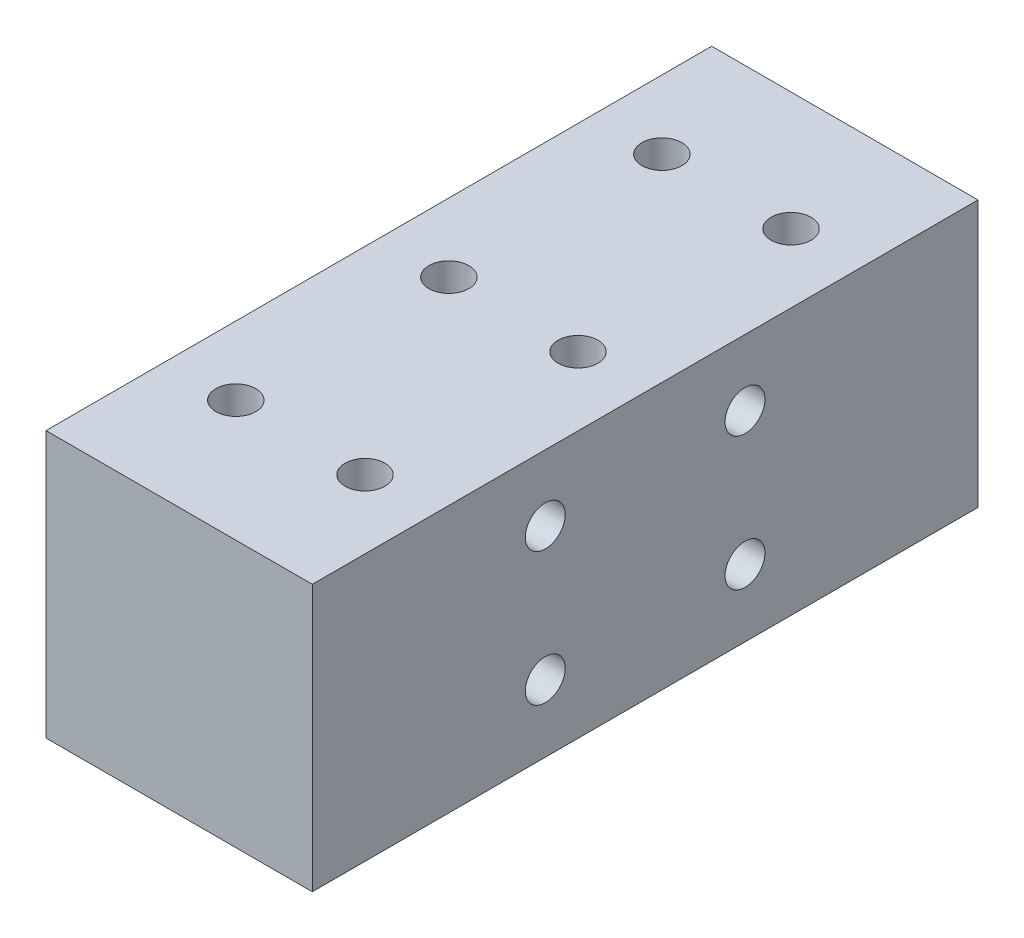
ISO-10303-21;
HEADER;
FILE_DESCRIPTION(('STEP AP214'),'2;1');
FILE_NAME('part.step','',(''),(''),'','','');
FILE_SCHEMA(('AUTOMOTIVE_DESIGN { 1 0 10303 214 1 1 1 1 }'));
ENDSEC;
DATA;
#1=APPLICATION_CONTEXT('core data for automotive mechanical design processes');
#2=APPLICATION_PROTOCOL_DEFINITION('international standard','automotive_design',2000,#1);
#3=PRODUCT_CONTEXT('',#1,'mechanical');
#4=PRODUCT('Part','Part','',(#3));
#5=PRODUCT_RELATED_PRODUCT_CATEGORY('part','',(#4));
#6=PRODUCT_DEFINITION_FORMATION('','',#4);
#7=PRODUCT_DEFINITION_CONTEXT('part definition',#1,'design');
#8=PRODUCT_DEFINITION('design','',#6,#7);
#9=PRODUCT_DEFINITION_SHAPE('','',#8);
#10=(LENGTH_UNIT() NAMED_UNIT(*) SI_UNIT(.MILLI.,.METRE.));
#11=(NAMED_UNIT(*) PLANE_ANGLE_UNIT() SI_UNIT($,.RADIAN.));
#12=(NAMED_UNIT(*) SI_UNIT($,.STERADIAN.) SOLID_ANGLE_UNIT());
#13=UNCERTAINTY_MEASURE_WITH_UNIT(LENGTH_MEASURE(1.E-05),#10,'distance_accuracy_value','');
#14=(GEOMETRIC_REPRESENTATION_CONTEXT(3) GLOBAL_UNCERTAINTY_ASSIGNED_CONTEXT((#13)) GLOBAL_UNIT_ASSIGNED_CONTEXT((#10,
#11,#12)) REPRESENTATION_CONTEXT('',''));
#15=CARTESIAN_POINT('',(0.,0.,0.));
#16=DIRECTION('',(0.,0.,1.));
#17=DIRECTION('',(1.,0.,0.));
#18=AXIS2_PLACEMENT_3D('',#15,#16,#17);
#19=CARTESIAN_POINT('',(10.,-10.,50.));
#20=DIRECTION('',(-1.,0.,0.));
#21=DIRECTION('',(0.,0.,1.));
#22=AXIS2_PLACEMENT_3D('',#19,#20,#21);
#23=PLANE('',#22);
#24=CARTESIAN_POINT('',(10.,5.05,17.5));
#25=DIRECTION('',(1.,0.,0.));
#26=DIRECTION('',(0.,0.,-1.));
#27=AXIS2_PLACEMENT_3D('',#24,#25,#26);
#28=CIRCLE('',#27,1.5);
#29=CARTESIAN_POINT('',(10.,5.05,16.));
#30=VERTEX_POINT('',#29);
#31=EDGE_CURVE('E123',#30,#30,#28,.T.);
#32=ORIENTED_EDGE('',*,*,#31,.F.);
#33=EDGE_LOOP('',(#32));
#34=FACE_BOUND('',#33,.T.);
#35=CARTESIAN_POINT('',(10.,-4.95,32.5));
#36=DIRECTION('',(1.,0.,0.));
#37=DIRECTION('',(0.,0.,-1.));
#38=AXIS2_PLACEMENT_3D('',#35,#36,#37);
#39=CIRCLE('',#38,1.5);
#40=CARTESIAN_POINT('',(10.,-4.95,31.));
#41=VERTEX_POINT('',#40);
#42=EDGE_CURVE('E124',#41,#41,#39,.T.);
#43=ORIENTED_EDGE('',*,*,#42,.F.);
#44=EDGE_LOOP('',(#43));
#45=FACE_BOUND('',#44,.T.);
#46=CARTESIAN_POINT('',(10.,-4.95,17.5));
#47=DIRECTION('',(1.,0.,0.));
#48=DIRECTION('',(0.,0.,-1.));
#49=AXIS2_PLACEMENT_3D('',#46,#47,#48);
#50=CIRCLE('',#49,1.5);
#51=CARTESIAN_POINT('',(10.,-4.95,16.));
#52=VERTEX_POINT('',#51);
#53=EDGE_CURVE('E131',#52,#52,#50,.T.);
#54=ORIENTED_EDGE('',*,*,#53,.F.);
#55=EDGE_LOOP('',(#54));
#56=FACE_BOUND('',#55,.T.);
#57=CARTESIAN_POINT('',(10.,5.05,32.5));
#58=DIRECTION('',(1.,0.,0.));
#59=DIRECTION('',(0.,0.,-1.));
#60=AXIS2_PLACEMENT_3D('',#57,#58,#59);
#61=CIRCLE('',#60,1.5);
#62=CARTESIAN_POINT('',(10.,5.05,31.));
#63=VERTEX_POINT('',#62);
#64=EDGE_CURVE('E120',#63,#63,#61,.T.);
#65=ORIENTED_EDGE('',*,*,#64,.F.);
#66=EDGE_LOOP('',(#65));
#67=FACE_BOUND('',#66,.T.);
#68=DIRECTION('',(0.,1.,0.));
#69=VECTOR('',#68,1.);
#70=CARTESIAN_POINT('',(10.,-10.,0.));
#71=LINE('',#70,#69);
#72=CARTESIAN_POINT('',(10.,-10.,0.));
#73=VERTEX_POINT('',#72);
#74=CARTESIAN_POINT('',(10.,10.,0.));
#75=VERTEX_POINT('',#74);
#76=EDGE_CURVE('E104',#73,#75,#71,.T.);
#77=ORIENTED_EDGE('',*,*,#76,.T.);
#78=DIRECTION('',(0.,0.,-1.));
#79=VECTOR('',#78,1.);
#80=CARTESIAN_POINT('',(10.,10.,50.));
#81=LINE('',#80,#79);
#82=CARTESIAN_POINT('',(10.,10.,50.));
#83=VERTEX_POINT('',#82);
#84=EDGE_CURVE('E11',#83,#75,#81,.T.);
#85=ORIENTED_EDGE('',*,*,#84,.F.);
#86=DIRECTION('',(0.,1.,0.));
#87=VECTOR('',#86,1.);
#88=CARTESIAN_POINT('',(10.,-10.,50.));
#89=LINE('',#88,#87);
#90=CARTESIAN_POINT('',(10.,-10.,50.));
#91=VERTEX_POINT('',#90);
#92=EDGE_CURVE('E92',#91,#83,#89,.T.);
#93=ORIENTED_EDGE('',*,*,#92,.F.);
#94=DIRECTION('',(0.,0.,-1.));
#95=VECTOR('',#94,1.);
#96=CARTESIAN_POINT('',(10.,-10.,50.));
#97=LINE('',#96,#95);
#98=EDGE_CURVE('E100',#91,#73,#97,.T.);
#99=ORIENTED_EDGE('',*,*,#98,.T.);
#100=EDGE_LOOP('',(#77,#85,#93,#99));
#101=FACE_BOUND('',#100,.T.);
#102=ADVANCED_FACE('F41',(#34,#45,#56,#67,#101),#23,.F.);
#103=CARTESIAN_POINT('',(-10.,10.,50.));
#104=DIRECTION('',(0.,-1.,0.));
#105=DIRECTION('',(0.,0.,-1.));
#106=AXIS2_PLACEMENT_3D('',#103,#104,#105);
#107=PLANE('',#106);
#108=CARTESIAN_POINT('',(4.85000000000739,10.,40.893026958124));
#109=DIRECTION('',(0.,-1.,0.));
#110=DIRECTION('',(0.,0.,-1.));
#111=AXIS2_PLACEMENT_3D('',#108,#109,#110);
#112=CIRCLE('',#111,1.5);
#113=CARTESIAN_POINT('',(4.85000000000739,10.,39.393026958124));
#114=VERTEX_POINT('',#113);
#115=EDGE_CURVE('E152',#114,#114,#112,.F.);
#116=ORIENTED_EDGE('',*,*,#115,.F.);
#117=EDGE_LOOP('',(#116));
#118=FACE_BOUND('',#117,.T.);
#119=CARTESIAN_POINT('',(4.8499999999996,10.,24.8930269581245));
#120=DIRECTION('',(0.,-1.,0.));
#121=DIRECTION('',(0.,0.,-1.));
#122=AXIS2_PLACEMENT_3D('',#119,#120,#121);
#123=CIRCLE('',#122,1.5);
#124=CARTESIAN_POINT('',(4.8499999999996,10.,23.3930269581245));
#125=VERTEX_POINT('',#124);
#126=EDGE_CURVE('E151',#125,#125,#123,.F.);
#127=ORIENTED_EDGE('',*,*,#126,.F.);
#128=EDGE_LOOP('',(#127));
#129=FACE_BOUND('',#128,.T.);
#130=CARTESIAN_POINT('',(4.85000000000738,10.,8.89302695812402));
#131=DIRECTION('',(0.,-1.,0.));
#132=DIRECTION('',(0.,0.,-1.));
#133=AXIS2_PLACEMENT_3D('',#130,#131,#132);
#134=CIRCLE('',#133,1.5);
#135=CARTESIAN_POINT('',(4.85000000000738,10.,7.39302695812402));
#136=VERTEX_POINT('',#135);
#137=EDGE_CURVE('E158',#136,#136,#134,.F.);
#138=ORIENTED_EDGE('',*,*,#137,.F.);
#139=EDGE_LOOP('',(#138));
#140=FACE_BOUND('',#139,.T.);
#141=CARTESIAN_POINT('',(-4.85000000000738,10.,8.89302695812402));
#142=DIRECTION('',(0.,-1.,0.));
#143=DIRECTION('',(0.,0.,-1.));
#144=AXIS2_PLACEMENT_3D('',#141,#142,#143);
#145=CIRCLE('',#144,1.5);
#146=CARTESIAN_POINT('',(-4.85000000000738,10.,7.39302695812402));
#147=VERTEX_POINT('',#146);
#148=EDGE_CURVE('E164',#147,#147,#145,.F.);
#149=ORIENTED_EDGE('',*,*,#148,.F.);
#150=EDGE_LOOP('',(#149));
#151=FACE_BOUND('',#150,.T.);
#152=CARTESIAN_POINT('',(-4.8499999999996,10.,24.8930269581245));
#153=DIRECTION('',(0.,-1.,0.));
#154=DIRECTION('',(0.,0.,-1.));
#155=AXIS2_PLACEMENT_3D('',#152,#153,#154);
#156=CIRCLE('',#155,1.5);
#157=CARTESIAN_POINT('',(-4.8499999999996,10.,23.3930269581245));
#158=VERTEX_POINT('',#157);
#159=EDGE_CURVE('E170',#158,#158,#156,.F.);
#160=ORIENTED_EDGE('',*,*,#159,.F.);
#161=EDGE_LOOP('',(#160));
#162=FACE_BOUND('',#161,.T.);
#163=CARTESIAN_POINT('',(-4.85000000000739,10.,40.893026958124));
#164=DIRECTION('',(0.,-1.,0.));
#165=DIRECTION('',(0.,0.,-1.));
#166=AXIS2_PLACEMENT_3D('',#163,#164,#165);
#167=CIRCLE('',#166,1.5);
#168=CARTESIAN_POINT('',(-4.85000000000739,10.,39.393026958124));
#169=VERTEX_POINT('',#168);
#170=EDGE_CURVE('E141',#169,#169,#167,.F.);
#171=ORIENTED_EDGE('',*,*,#170,.F.);
#172=EDGE_LOOP('',(#171));
#173=FACE_BOUND('',#172,.T.);
#174=DIRECTION('',(-1.,0.,0.));
#175=VECTOR('',#174,1.);
#176=CARTESIAN_POINT('',(-10.,10.,0.));
#177=LINE('',#176,#175);
#178=CARTESIAN_POINT('',(-10.,10.,0.));
#179=VERTEX_POINT('',#178);
#180=EDGE_CURVE('E96',#75,#179,#177,.T.);
#181=ORIENTED_EDGE('',*,*,#180,.T.);
#182=DIRECTION('',(0.,0.,-1.));
#183=VECTOR('',#182,1.);
#184=CARTESIAN_POINT('',(-10.,10.,50.));
#185=LINE('',#184,#183);
#186=CARTESIAN_POINT('',(-10.,10.,50.));
#187=VERTEX_POINT('',#186);
#188=EDGE_CURVE('E49',#187,#179,#185,.T.);
#189=ORIENTED_EDGE('',*,*,#188,.F.);
#190=DIRECTION('',(-1.,0.,0.));
#191=VECTOR('',#190,1.);
#192=CARTESIAN_POINT('',(-10.,10.,50.));
#193=LINE('',#192,#191);
#194=EDGE_CURVE('E87',#83,#187,#193,.T.);
#195=ORIENTED_EDGE('',*,*,#194,.F.);
#196=ORIENTED_EDGE('',*,*,#84,.T.);
#197=EDGE_LOOP('',(#181,#189,#195,#196));
#198=FACE_BOUND('',#197,.T.);
#199=ADVANCED_FACE('F95',(#118,#129,#140,#151,#162,#173,#198),#107,.F.);
#200=CARTESIAN_POINT('',(-10.,-10.,50.));
#201=DIRECTION('',(1.,0.,0.));
#202=DIRECTION('',(0.,0.,-1.));
#203=AXIS2_PLACEMENT_3D('',#200,#201,#202);
#204=PLANE('',#203);
#205=CARTESIAN_POINT('',(-10.,5.05,17.5));
#206=DIRECTION('',(1.,0.,0.));
#207=DIRECTION('',(0.,0.,-1.));
#208=AXIS2_PLACEMENT_3D('',#205,#206,#207);
#209=CIRCLE('',#208,1.5);
#210=CARTESIAN_POINT('',(-10.,5.05,16.));
#211=VERTEX_POINT('',#210);
#212=EDGE_CURVE('E127',#211,#211,#209,.F.);
#213=ORIENTED_EDGE('',*,*,#212,.F.);
#214=EDGE_LOOP('',(#213));
#215=FACE_BOUND('',#214,.T.);
#216=CARTESIAN_POINT('',(-10.,-4.95,32.5));
#217=DIRECTION('',(1.,0.,0.));
#218=DIRECTION('',(0.,0.,-1.));
#219=AXIS2_PLACEMENT_3D('',#216,#217,#218);
#220=CIRCLE('',#219,1.5);
#221=CARTESIAN_POINT('',(-10.,-4.95,31.));
#222=VERTEX_POINT('',#221);
#223=EDGE_CURVE('E128',#222,#222,#220,.F.);
#224=ORIENTED_EDGE('',*,*,#223,.F.);
#225=EDGE_LOOP('',(#224));
#226=FACE_BOUND('',#225,.T.);
#227=CARTESIAN_POINT('',(-10.,-4.95,17.5));
#228=DIRECTION('',(1.,0.,0.));
#229=DIRECTION('',(0.,0.,-1.));
#230=AXIS2_PLACEMENT_3D('',#227,#228,#229);
#231=CIRCLE('',#230,1.5);
#232=CARTESIAN_POINT('',(-10.,-4.95,16.));
#233=VERTEX_POINT('',#232);
#234=EDGE_CURVE('E138',#233,#233,#231,.F.);
#235=ORIENTED_EDGE('',*,*,#234,.F.);
#236=EDGE_LOOP('',(#235));
#237=FACE_BOUND('',#236,.T.);
#238=CARTESIAN_POINT('',(-10.,5.05,32.5));
#239=DIRECTION('',(1.,0.,0.));
#240=DIRECTION('',(0.,0.,-1.));
#241=AXIS2_PLACEMENT_3D('',#238,#239,#240);
#242=CIRCLE('',#241,1.5);
#243=CARTESIAN_POINT('',(-10.,5.05,31.));
#244=VERTEX_POINT('',#243);
#245=EDGE_CURVE('E107',#244,#244,#242,.F.);
#246=ORIENTED_EDGE('',*,*,#245,.F.);
#247=EDGE_LOOP('',(#246));
#248=FACE_BOUND('',#247,.T.);
#249=DIRECTION('',(0.,-1.,0.));
#250=VECTOR('',#249,1.);
#251=CARTESIAN_POINT('',(-10.,-10.,0.));
#252=LINE('',#251,#250);
#253=CARTESIAN_POINT('',(-10.,-10.,0.));
#254=VERTEX_POINT('',#253);
#255=EDGE_CURVE('E74',#179,#254,#252,.T.);
#256=ORIENTED_EDGE('',*,*,#255,.T.);
#257=DIRECTION('',(0.,0.,-1.));
#258=VECTOR('',#257,1.);
#259=CARTESIAN_POINT('',(-10.,-10.,50.));
#260=LINE('',#259,#258);
#261=CARTESIAN_POINT('',(-10.,-10.,50.));
#262=VERTEX_POINT('',#261);
#263=EDGE_CURVE('E97',#262,#254,#260,.T.);
#264=ORIENTED_EDGE('',*,*,#263,.F.);
#265=DIRECTION('',(0.,-1.,0.));
#266=VECTOR('',#265,1.);
#267=CARTESIAN_POINT('',(-10.,-10.,50.));
#268=LINE('',#267,#266);
#269=EDGE_CURVE('E90',#187,#262,#268,.T.);
#270=ORIENTED_EDGE('',*,*,#269,.F.);
#271=ORIENTED_EDGE('',*,*,#188,.T.);
#272=EDGE_LOOP('',(#256,#264,#270,#271));
#273=FACE_BOUND('',#272,.T.);
#274=ADVANCED_FACE('F98',(#215,#226,#237,#248,#273),#204,.F.);
#275=CARTESIAN_POINT('',(-10.,-10.,50.));
#276=DIRECTION('',(0.,1.,0.));
#277=DIRECTION('',(0.,0.,1.));
#278=AXIS2_PLACEMENT_3D('',#275,#276,#277);
#279=PLANE('',#278);
#280=CARTESIAN_POINT('',(4.85000000000739,-10.,40.893026958124));
#281=DIRECTION('',(0.,-1.,0.));
#282=DIRECTION('',(0.,0.,1.));
#283=AXIS2_PLACEMENT_3D('',#280,#281,#282);
#284=CIRCLE('',#283,1.5);
#285=CARTESIAN_POINT('',(4.85000000000739,-10.,42.393026958124));
#286=VERTEX_POINT('',#285);
#287=EDGE_CURVE('E148',#286,#286,#284,.T.);
#288=ORIENTED_EDGE('',*,*,#287,.F.);
#289=EDGE_LOOP('',(#288));
#290=FACE_BOUND('',#289,.T.);
#291=CARTESIAN_POINT('',(4.8499999999996,-10.,24.8930269581245));
#292=DIRECTION('',(0.,-1.,0.));
#293=DIRECTION('',(0.,0.,1.));
#294=AXIS2_PLACEMENT_3D('',#291,#292,#293);
#295=CIRCLE('',#294,1.5);
#296=CARTESIAN_POINT('',(4.8499999999996,-10.,26.3930269581245));
#297=VERTEX_POINT('',#296);
#298=EDGE_CURVE('E155',#297,#297,#295,.T.);
#299=ORIENTED_EDGE('',*,*,#298,.F.);
#300=EDGE_LOOP('',(#299));
#301=FACE_BOUND('',#300,.T.);
#302=CARTESIAN_POINT('',(4.85000000000738,-10.,8.89302695812402));
#303=DIRECTION('',(0.,-1.,0.));
#304=DIRECTION('',(0.,0.,1.));
#305=AXIS2_PLACEMENT_3D('',#302,#303,#304);
#306=CIRCLE('',#305,1.5);
#307=CARTESIAN_POINT('',(4.85000000000738,-10.,10.393026958124));
#308=VERTEX_POINT('',#307);
#309=EDGE_CURVE('E161',#308,#308,#306,.T.);
#310=ORIENTED_EDGE('',*,*,#309,.F.);
#311=EDGE_LOOP('',(#310));
#312=FACE_BOUND('',#311,.T.);
#313=CARTESIAN_POINT('',(-4.85000000000738,-10.,8.89302695812402));
#314=DIRECTION('',(0.,-1.,0.));
#315=DIRECTION('',(0.,0.,-1.));
#316=AXIS2_PLACEMENT_3D('',#313,#314,#315);
#317=CIRCLE('',#316,1.5);
#318=CARTESIAN_POINT('',(-4.85000000000738,-10.,7.39302695812402));
#319=VERTEX_POINT('',#318);
#320=EDGE_CURVE('E167',#319,#319,#317,.T.);
#321=ORIENTED_EDGE('',*,*,#320,.F.);
#322=EDGE_LOOP('',(#321));
#323=FACE_BOUND('',#322,.T.);
#324=CARTESIAN_POINT('',(-4.8499999999996,-10.,24.8930269581245));
#325=DIRECTION('',(0.,-1.,0.));
#326=DIRECTION('',(0.,0.,-1.));
#327=AXIS2_PLACEMENT_3D('',#324,#325,#326);
#328=CIRCLE('',#327,1.5);
#329=CARTESIAN_POINT('',(-4.8499999999996,-10.,23.3930269581245));
#330=VERTEX_POINT('',#329);
#331=EDGE_CURVE('E147',#330,#330,#328,.T.);
#332=ORIENTED_EDGE('',*,*,#331,.F.);
#333=EDGE_LOOP('',(#332));
#334=FACE_BOUND('',#333,.T.);
#335=CARTESIAN_POINT('',(-4.85000000000739,-10.,40.893026958124));
#336=DIRECTION('',(0.,-1.,0.));
#337=DIRECTION('',(0.,0.,-1.));
#338=AXIS2_PLACEMENT_3D('',#335,#336,#337);
#339=CIRCLE('',#338,1.5);
#340=CARTESIAN_POINT('',(-4.85000000000739,-10.,39.393026958124));
#341=VERTEX_POINT('',#340);
#342=EDGE_CURVE('E144',#341,#341,#339,.T.);
#343=ORIENTED_EDGE('',*,*,#342,.F.);
#344=EDGE_LOOP('',(#343));
#345=FACE_BOUND('',#344,.T.);
#346=DIRECTION('',(1.,0.,0.));
#347=VECTOR('',#346,1.);
#348=CARTESIAN_POINT('',(-10.,-10.,0.));
#349=LINE('',#348,#347);
#350=EDGE_CURVE('E80',#254,#73,#349,.T.);
#351=ORIENTED_EDGE('',*,*,#350,.T.);
#352=ORIENTED_EDGE('',*,*,#98,.F.);
#353=DIRECTION('',(1.,0.,0.));
#354=VECTOR('',#353,1.);
#355=CARTESIAN_POINT('',(-10.,-10.,50.));
#356=LINE('',#355,#354);
#357=EDGE_CURVE('E57',#262,#91,#356,.T.);
#358=ORIENTED_EDGE('',*,*,#357,.F.);
#359=ORIENTED_EDGE('',*,*,#263,.T.);
#360=EDGE_LOOP('',(#351,#352,#358,#359));
#361=FACE_BOUND('',#360,.T.);
#362=ADVANCED_FACE('F112',(#290,#301,#312,#323,#334,#345,#361),#279,.F.);
#363=CARTESIAN_POINT('',(0.,0.,50.));
#364=DIRECTION('',(0.,0.,-1.));
#365=DIRECTION('',(-1.,0.,0.));
#366=AXIS2_PLACEMENT_3D('',#363,#364,#365);
#367=PLANE('',#366);
#368=ORIENTED_EDGE('',*,*,#92,.T.);
#369=ORIENTED_EDGE('',*,*,#194,.T.);
#370=ORIENTED_EDGE('',*,*,#269,.T.);
#371=ORIENTED_EDGE('',*,*,#357,.T.);
#372=EDGE_LOOP('',(#368,#369,#370,#371));
#373=FACE_BOUND('',#372,.T.);
#374=ADVANCED_FACE('F88',(#373),#367,.F.);
#375=CARTESIAN_POINT('',(0.,0.,0.));
#376=DIRECTION('',(0.,0.,-1.));
#377=DIRECTION('',(-1.,0.,0.));
#378=AXIS2_PLACEMENT_3D('',#375,#376,#377);
#379=PLANE('',#378);
#380=ORIENTED_EDGE('',*,*,#76,.F.);
#381=ORIENTED_EDGE('',*,*,#350,.F.);
#382=ORIENTED_EDGE('',*,*,#255,.F.);
#383=ORIENTED_EDGE('',*,*,#180,.F.);
#384=EDGE_LOOP('',(#380,#381,#382,#383));
#385=FACE_BOUND('',#384,.T.);
#386=ADVANCED_FACE('F115',(#385),#379,.T.);
#387=CARTESIAN_POINT('',(-14.2426406871193,5.05,32.5));
#388=DIRECTION('',(1.,0.,0.));
#389=DIRECTION('',(0.,0.,-1.));
#390=AXIS2_PLACEMENT_3D('',#387,#388,#389);
#391=CYLINDRICAL_SURFACE('',#390,1.5);
#392=ORIENTED_EDGE('',*,*,#245,.T.);
#393=EDGE_LOOP('',(#392));
#394=FACE_BOUND('',#393,.T.);
#395=ORIENTED_EDGE('',*,*,#64,.T.);
#396=EDGE_LOOP('',(#395));
#397=FACE_BOUND('',#396,.T.);
#398=ADVANCED_FACE('F219',(#394,#397),#391,.F.);
#399=CARTESIAN_POINT('',(-14.2426406871193,-4.95,17.5));
#400=DIRECTION('',(1.,0.,0.));
#401=DIRECTION('',(0.,0.,-1.));
#402=AXIS2_PLACEMENT_3D('',#399,#400,#401);
#403=CYLINDRICAL_SURFACE('',#402,1.5);
#404=ORIENTED_EDGE('',*,*,#234,.T.);
#405=EDGE_LOOP('',(#404));
#406=FACE_BOUND('',#405,.T.);
#407=ORIENTED_EDGE('',*,*,#53,.T.);
#408=EDGE_LOOP('',(#407));
#409=FACE_BOUND('',#408,.T.);
#410=ADVANCED_FACE('F221',(#406,#409),#403,.F.);
#411=CARTESIAN_POINT('',(-14.2426406871193,-4.95,32.5));
#412=DIRECTION('',(1.,0.,0.));
#413=DIRECTION('',(0.,0.,-1.));
#414=AXIS2_PLACEMENT_3D('',#411,#412,#413);
#415=CYLINDRICAL_SURFACE('',#414,1.5);
#416=ORIENTED_EDGE('',*,*,#223,.T.);
#417=EDGE_LOOP('',(#416));
#418=FACE_BOUND('',#417,.T.);
#419=ORIENTED_EDGE('',*,*,#42,.T.);
#420=EDGE_LOOP('',(#419));
#421=FACE_BOUND('',#420,.T.);
#422=ADVANCED_FACE('F227',(#418,#421),#415,.F.);
#423=CARTESIAN_POINT('',(-14.2426406871193,5.05,17.5));
#424=DIRECTION('',(1.,0.,0.));
#425=DIRECTION('',(0.,0.,-1.));
#426=AXIS2_PLACEMENT_3D('',#423,#424,#425);
#427=CYLINDRICAL_SURFACE('',#426,1.5);
#428=ORIENTED_EDGE('',*,*,#212,.T.);
#429=EDGE_LOOP('',(#428));
#430=FACE_BOUND('',#429,.T.);
#431=ORIENTED_EDGE('',*,*,#31,.T.);
#432=EDGE_LOOP('',(#431));
#433=FACE_BOUND('',#432,.T.);
#434=ADVANCED_FACE('F189',(#430,#433),#427,.F.);
#435=CARTESIAN_POINT('',(-4.85000000000739,14.2426406871193,40.893026958124));
#436=DIRECTION('',(0.,-1.,0.));
#437=DIRECTION('',(0.,0.,-1.));
#438=AXIS2_PLACEMENT_3D('',#435,#436,#437);
#439=CYLINDRICAL_SURFACE('',#438,1.5);
#440=ORIENTED_EDGE('',*,*,#170,.T.);
#441=EDGE_LOOP('',(#440));
#442=FACE_BOUND('',#441,.T.);
#443=ORIENTED_EDGE('',*,*,#342,.T.);
#444=EDGE_LOOP('',(#443));
#445=FACE_BOUND('',#444,.T.);
#446=ADVANCED_FACE('F186',(#442,#445),#439,.F.);
#447=CARTESIAN_POINT('',(-4.8499999999996,14.2426406871193,24.8930269581245));
#448=DIRECTION('',(0.,-1.,0.));
#449=DIRECTION('',(0.,0.,-1.));
#450=AXIS2_PLACEMENT_3D('',#447,#448,#449);
#451=CYLINDRICAL_SURFACE('',#450,1.5);
#452=ORIENTED_EDGE('',*,*,#159,.T.);
#453=EDGE_LOOP('',(#452));
#454=FACE_BOUND('',#453,.T.);
#455=ORIENTED_EDGE('',*,*,#331,.T.);
#456=EDGE_LOOP('',(#455));
#457=FACE_BOUND('',#456,.T.);
#458=ADVANCED_FACE('F178',(#454,#457),#451,.F.);
#459=CARTESIAN_POINT('',(-4.85000000000738,14.2426406871193,8.89302695812402));
#460=DIRECTION('',(0.,-1.,0.));
#461=DIRECTION('',(0.,0.,-1.));
#462=AXIS2_PLACEMENT_3D('',#459,#460,#461);
#463=CYLINDRICAL_SURFACE('',#462,1.5);
#464=ORIENTED_EDGE('',*,*,#148,.T.);
#465=EDGE_LOOP('',(#464));
#466=FACE_BOUND('',#465,.T.);
#467=ORIENTED_EDGE('',*,*,#320,.T.);
#468=EDGE_LOOP('',(#467));
#469=FACE_BOUND('',#468,.T.);
#470=ADVANCED_FACE('F248',(#466,#469),#463,.F.);
#471=CARTESIAN_POINT('',(4.85000000000738,14.2426406871193,8.89302695812402));
#472=DIRECTION('',(0.,-1.,0.));
#473=DIRECTION('',(0.,0.,-1.));
#474=AXIS2_PLACEMENT_3D('',#471,#472,#473);
#475=CYLINDRICAL_SURFACE('',#474,1.5);
#476=ORIENTED_EDGE('',*,*,#137,.T.);
#477=EDGE_LOOP('',(#476));
#478=FACE_BOUND('',#477,.T.);
#479=ORIENTED_EDGE('',*,*,#309,.T.);
#480=EDGE_LOOP('',(#479));
#481=FACE_BOUND('',#480,.T.);
#482=ADVANCED_FACE('F244',(#478,#481),#475,.F.);
#483=CARTESIAN_POINT('',(4.8499999999996,14.2426406871193,24.8930269581245));
#484=DIRECTION('',(0.,-1.,0.));
#485=DIRECTION('',(0.,0.,-1.));
#486=AXIS2_PLACEMENT_3D('',#483,#484,#485);
#487=CYLINDRICAL_SURFACE('',#486,1.5);
#488=ORIENTED_EDGE('',*,*,#126,.T.);
#489=EDGE_LOOP('',(#488));
#490=FACE_BOUND('',#489,.T.);
#491=ORIENTED_EDGE('',*,*,#298,.T.);
#492=EDGE_LOOP('',(#491));
#493=FACE_BOUND('',#492,.T.);
#494=ADVANCED_FACE('F240',(#490,#493),#487,.F.);
#495=CARTESIAN_POINT('',(4.85000000000739,14.2426406871193,40.893026958124));
#496=DIRECTION('',(0.,-1.,0.));
#497=DIRECTION('',(0.,0.,-1.));
#498=AXIS2_PLACEMENT_3D('',#495,#496,#497);
#499=CYLINDRICAL_SURFACE('',#498,1.5);
#500=ORIENTED_EDGE('',*,*,#115,.T.);
#501=EDGE_LOOP('',(#500));
#502=FACE_BOUND('',#501,.T.);
#503=ORIENTED_EDGE('',*,*,#287,.T.);
#504=EDGE_LOOP('',(#503));
#505=FACE_BOUND('',#504,.T.);
#506=ADVANCED_FACE('F237',(#502,#505),#499,.F.);
#507=CLOSED_SHELL('',(#102,#199,#274,#362,#374,#386,#398,#410,#422,#434,#446,#458,#470,#482,
#494,#506));
#508=MANIFOLD_SOLID_BREP('B2',#507);
#509=ADVANCED_BREP_SHAPE_REPRESENTATION('',(#18,#508),#14);
#510=SHAPE_DEFINITION_REPRESENTATION(#9,#509);
ENDSEC;
END-ISO-10303-21;
